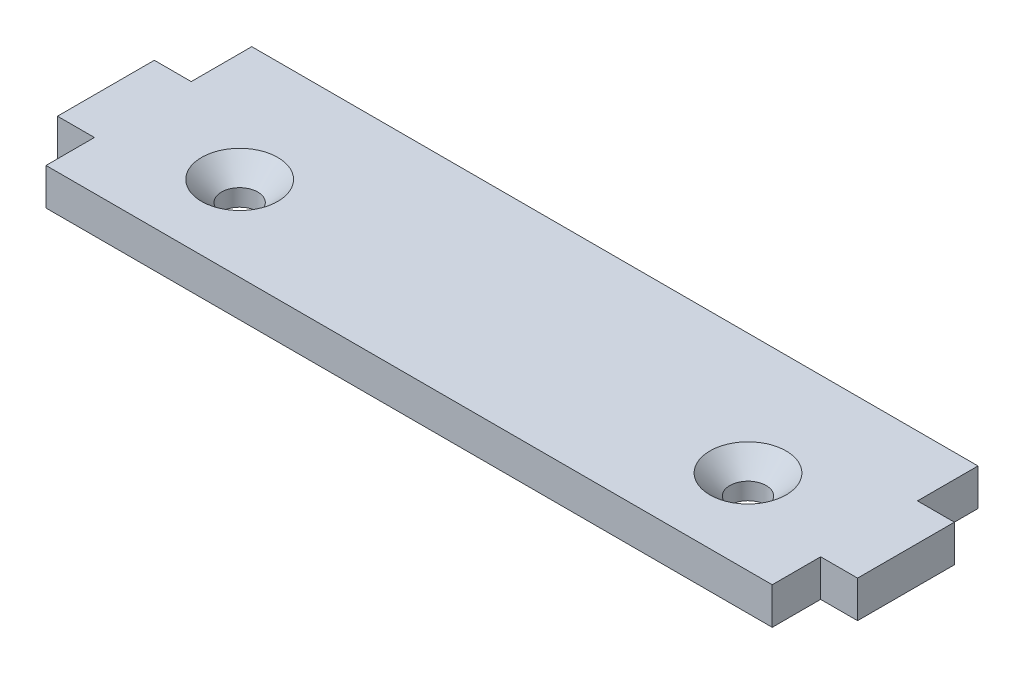
ISO-10303-21;
HEADER;
FILE_DESCRIPTION(('STEP AP214'),'2;1');
FILE_NAME('part.step','',(''),(''),'','','');
FILE_SCHEMA(('AUTOMOTIVE_DESIGN { 1 0 10303 214 1 1 1 1 }'));
ENDSEC;
DATA;
#1=APPLICATION_CONTEXT('core data for automotive mechanical design processes');
#2=APPLICATION_PROTOCOL_DEFINITION('international standard','automotive_design',2000,#1);
#3=PRODUCT_CONTEXT('',#1,'mechanical');
#4=PRODUCT('Part','Part','',(#3));
#5=PRODUCT_RELATED_PRODUCT_CATEGORY('part','',(#4));
#6=PRODUCT_DEFINITION_FORMATION('','',#4);
#7=PRODUCT_DEFINITION_CONTEXT('part definition',#1,'design');
#8=PRODUCT_DEFINITION('design','',#6,#7);
#9=PRODUCT_DEFINITION_SHAPE('','',#8);
#10=(LENGTH_UNIT() NAMED_UNIT(*) SI_UNIT(.MILLI.,.METRE.));
#11=(NAMED_UNIT(*) PLANE_ANGLE_UNIT() SI_UNIT($,.RADIAN.));
#12=(NAMED_UNIT(*) SI_UNIT($,.STERADIAN.) SOLID_ANGLE_UNIT());
#13=UNCERTAINTY_MEASURE_WITH_UNIT(LENGTH_MEASURE(1.E-05),#10,'distance_accuracy_value','');
#14=(GEOMETRIC_REPRESENTATION_CONTEXT(3) GLOBAL_UNCERTAINTY_ASSIGNED_CONTEXT((#13)) GLOBAL_UNIT_ASSIGNED_CONTEXT((#10,
#11,#12)) REPRESENTATION_CONTEXT('',''));
#15=CARTESIAN_POINT('',(0.,0.,0.));
#16=DIRECTION('',(0.,0.,1.));
#17=DIRECTION('',(1.,0.,0.));
#18=AXIS2_PLACEMENT_3D('',#15,#16,#17);
#19=CARTESIAN_POINT('',(66.1,3.05,0.));
#20=DIRECTION('',(-1.,0.,0.));
#21=DIRECTION('',(0.,0.,1.));
#22=AXIS2_PLACEMENT_3D('',#19,#20,#21);
#23=PLANE('',#22);
#24=DIRECTION('',(0.,0.,-1.));
#25=VECTOR('',#24,1.);
#26=CARTESIAN_POINT('',(66.1,0.,0.));
#27=LINE('',#26,#25);
#28=CARTESIAN_POINT('',(66.1,0.,-4.));
#29=VERTEX_POINT('',#28);
#30=CARTESIAN_POINT('',(66.1,0.,-12.));
#31=VERTEX_POINT('',#30);
#32=EDGE_CURVE('E180',#29,#31,#27,.T.);
#33=ORIENTED_EDGE('',*,*,#32,.T.);
#34=DIRECTION('',(0.,-1.,0.));
#35=VECTOR('',#34,1.);
#36=CARTESIAN_POINT('',(66.1,3.05,-12.));
#37=LINE('',#36,#35);
#38=CARTESIAN_POINT('',(66.1,3.05,-12.));
#39=VERTEX_POINT('',#38);
#40=EDGE_CURVE('E11',#39,#31,#37,.T.);
#41=ORIENTED_EDGE('',*,*,#40,.F.);
#42=DIRECTION('',(0.,0.,-1.));
#43=VECTOR('',#42,1.);
#44=CARTESIAN_POINT('',(66.1,3.05,0.));
#45=LINE('',#44,#43);
#46=CARTESIAN_POINT('',(66.1,3.05,-4.));
#47=VERTEX_POINT('',#46);
#48=EDGE_CURVE('E224',#47,#39,#45,.T.);
#49=ORIENTED_EDGE('',*,*,#48,.F.);
#50=DIRECTION('',(0.,-1.,0.));
#51=VECTOR('',#50,1.);
#52=CARTESIAN_POINT('',(66.1,3.05,-4.));
#53=LINE('',#52,#51);
#54=EDGE_CURVE('E63',#47,#29,#53,.T.);
#55=ORIENTED_EDGE('',*,*,#54,.T.);
#56=EDGE_LOOP('',(#33,#41,#49,#55));
#57=FACE_BOUND('',#56,.T.);
#58=ADVANCED_FACE('F45',(#57),#23,.F.);
#59=CARTESIAN_POINT('',(0.,3.05,-12.));
#60=DIRECTION('',(0.,0.,1.));
#61=DIRECTION('',(1.,0.,0.));
#62=AXIS2_PLACEMENT_3D('',#59,#60,#61);
#63=PLANE('',#62);
#64=DIRECTION('',(-1.,0.,0.));
#65=VECTOR('',#64,1.);
#66=CARTESIAN_POINT('',(0.,0.,-12.));
#67=LINE('',#66,#65);
#68=CARTESIAN_POINT('',(63.05,0.,-12.));
#69=VERTEX_POINT('',#68);
#70=EDGE_CURVE('E183',#31,#69,#67,.T.);
#71=ORIENTED_EDGE('',*,*,#70,.T.);
#72=DIRECTION('',(0.,-1.,0.));
#73=VECTOR('',#72,1.);
#74=CARTESIAN_POINT('',(63.05,3.05,-12.));
#75=LINE('',#74,#73);
#76=CARTESIAN_POINT('',(63.05,3.05,-12.));
#77=VERTEX_POINT('',#76);
#78=EDGE_CURVE('E55',#77,#69,#75,.T.);
#79=ORIENTED_EDGE('',*,*,#78,.F.);
#80=DIRECTION('',(-1.,0.,0.));
#81=VECTOR('',#80,1.);
#82=CARTESIAN_POINT('',(0.,3.05,-12.));
#83=LINE('',#82,#81);
#84=EDGE_CURVE('E114',#39,#77,#83,.T.);
#85=ORIENTED_EDGE('',*,*,#84,.F.);
#86=ORIENTED_EDGE('',*,*,#40,.T.);
#87=EDGE_LOOP('',(#71,#79,#85,#86));
#88=FACE_BOUND('',#87,.T.);
#89=ADVANCED_FACE('F255',(#88),#63,.F.);
#90=CARTESIAN_POINT('',(63.0499999999999,3.05,3.4999780851308E-13));
#91=DIRECTION('',(1.,0.,0.));
#92=DIRECTION('',(0.,0.,-1.));
#93=AXIS2_PLACEMENT_3D('',#90,#91,#92);
#94=PLANE('',#93);
#95=DIRECTION('',(0.,0.,1.));
#96=VECTOR('',#95,1.);
#97=CARTESIAN_POINT('',(63.0499999999999,0.,3.4999780851308E-13));
#98=LINE('',#97,#96);
#99=CARTESIAN_POINT('',(63.05,0.,-17.));
#100=VERTEX_POINT('',#99);
#101=EDGE_CURVE('E187',#100,#69,#98,.T.);
#102=ORIENTED_EDGE('',*,*,#101,.F.);
#103=DIRECTION('',(0.,-1.,0.));
#104=VECTOR('',#103,1.);
#105=CARTESIAN_POINT('',(63.05,3.05,-17.));
#106=LINE('',#105,#104);
#107=CARTESIAN_POINT('',(63.05,3.05,-17.));
#108=VERTEX_POINT('',#107);
#109=EDGE_CURVE('E246',#108,#100,#106,.T.);
#110=ORIENTED_EDGE('',*,*,#109,.F.);
#111=DIRECTION('',(0.,0.,1.));
#112=VECTOR('',#111,1.);
#113=CARTESIAN_POINT('',(63.0499999999999,3.05,3.4999780851308E-13));
#114=LINE('',#113,#112);
#115=EDGE_CURVE('E254',#108,#77,#114,.T.);
#116=ORIENTED_EDGE('',*,*,#115,.T.);
#117=ORIENTED_EDGE('',*,*,#78,.T.);
#118=EDGE_LOOP('',(#102,#110,#116,#117));
#119=FACE_BOUND('',#118,.T.);
#120=ADVANCED_FACE('F252',(#119),#94,.T.);
#121=CARTESIAN_POINT('',(0.,3.05,-17.));
#122=DIRECTION('',(0.,0.,-1.));
#123=DIRECTION('',(-1.,0.,0.));
#124=AXIS2_PLACEMENT_3D('',#121,#122,#123);
#125=PLANE('',#124);
#126=DIRECTION('',(1.,0.,0.));
#127=VECTOR('',#126,1.);
#128=CARTESIAN_POINT('',(0.,0.,-17.));
#129=LINE('',#128,#127);
#130=CARTESIAN_POINT('',(3.05,0.,-17.));
#131=VERTEX_POINT('',#130);
#132=EDGE_CURVE('E191',#131,#100,#129,.T.);
#133=ORIENTED_EDGE('',*,*,#132,.F.);
#134=DIRECTION('',(0.,-1.,0.));
#135=VECTOR('',#134,1.);
#136=CARTESIAN_POINT('',(3.05,3.05,-17.));
#137=LINE('',#136,#135);
#138=CARTESIAN_POINT('',(3.05,3.05,-17.));
#139=VERTEX_POINT('',#138);
#140=EDGE_CURVE('E243',#139,#131,#137,.T.);
#141=ORIENTED_EDGE('',*,*,#140,.F.);
#142=DIRECTION('',(1.,0.,0.));
#143=VECTOR('',#142,1.);
#144=CARTESIAN_POINT('',(0.,3.05,-17.));
#145=LINE('',#144,#143);
#146=EDGE_CURVE('E266',#139,#108,#145,.T.);
#147=ORIENTED_EDGE('',*,*,#146,.T.);
#148=ORIENTED_EDGE('',*,*,#109,.T.);
#149=EDGE_LOOP('',(#133,#141,#147,#148));
#150=FACE_BOUND('',#149,.T.);
#151=ADVANCED_FACE('F262',(#150),#125,.T.);
#152=CARTESIAN_POINT('',(3.05,3.05,0.));
#153=DIRECTION('',(1.,0.,0.));
#154=DIRECTION('',(0.,0.,-1.));
#155=AXIS2_PLACEMENT_3D('',#152,#153,#154);
#156=PLANE('',#155);
#157=DIRECTION('',(0.,0.,1.));
#158=VECTOR('',#157,1.);
#159=CARTESIAN_POINT('',(3.05,0.,0.));
#160=LINE('',#159,#158);
#161=CARTESIAN_POINT('',(3.05,0.,-12.));
#162=VERTEX_POINT('',#161);
#163=EDGE_CURVE('E195',#131,#162,#160,.T.);
#164=ORIENTED_EDGE('',*,*,#163,.T.);
#165=DIRECTION('',(0.,-1.,0.));
#166=VECTOR('',#165,1.);
#167=CARTESIAN_POINT('',(3.05,3.05,-12.));
#168=LINE('',#167,#166);
#169=CARTESIAN_POINT('',(3.05,3.05,-12.));
#170=VERTEX_POINT('',#169);
#171=EDGE_CURVE('E240',#170,#162,#168,.T.);
#172=ORIENTED_EDGE('',*,*,#171,.F.);
#173=DIRECTION('',(0.,0.,1.));
#174=VECTOR('',#173,1.);
#175=CARTESIAN_POINT('',(3.05,3.05,0.));
#176=LINE('',#175,#174);
#177=EDGE_CURVE('E271',#139,#170,#176,.T.);
#178=ORIENTED_EDGE('',*,*,#177,.F.);
#179=ORIENTED_EDGE('',*,*,#140,.T.);
#180=EDGE_LOOP('',(#164,#172,#178,#179));
#181=FACE_BOUND('',#180,.T.);
#182=ADVANCED_FACE('F468',(#181),#156,.F.);
#183=CARTESIAN_POINT('',(0.,3.05,-12.));
#184=DIRECTION('',(0.,0.,-1.));
#185=DIRECTION('',(-1.,0.,0.));
#186=AXIS2_PLACEMENT_3D('',#183,#184,#185);
#187=PLANE('',#186);
#188=DIRECTION('',(1.,0.,0.));
#189=VECTOR('',#188,1.);
#190=CARTESIAN_POINT('',(0.,0.,-12.));
#191=LINE('',#190,#189);
#192=CARTESIAN_POINT('',(0.,0.,-12.));
#193=VERTEX_POINT('',#192);
#194=EDGE_CURVE('E199',#193,#162,#191,.T.);
#195=ORIENTED_EDGE('',*,*,#194,.F.);
#196=DIRECTION('',(0.,-1.,0.));
#197=VECTOR('',#196,1.);
#198=CARTESIAN_POINT('',(0.,3.05,-12.));
#199=LINE('',#198,#197);
#200=CARTESIAN_POINT('',(0.,3.05,-12.));
#201=VERTEX_POINT('',#200);
#202=EDGE_CURVE('E237',#201,#193,#199,.T.);
#203=ORIENTED_EDGE('',*,*,#202,.F.);
#204=DIRECTION('',(1.,0.,0.));
#205=VECTOR('',#204,1.);
#206=CARTESIAN_POINT('',(0.,3.05,-12.));
#207=LINE('',#206,#205);
#208=EDGE_CURVE('E278',#201,#170,#207,.T.);
#209=ORIENTED_EDGE('',*,*,#208,.T.);
#210=ORIENTED_EDGE('',*,*,#171,.T.);
#211=EDGE_LOOP('',(#195,#203,#209,#210));
#212=FACE_BOUND('',#211,.T.);
#213=ADVANCED_FACE('F457',(#212),#187,.T.);
#214=CARTESIAN_POINT('',(0.,3.05,0.));
#215=DIRECTION('',(-1.,0.,0.));
#216=DIRECTION('',(0.,0.,1.));
#217=AXIS2_PLACEMENT_3D('',#214,#215,#216);
#218=PLANE('',#217);
#219=DIRECTION('',(0.,0.,-1.));
#220=VECTOR('',#219,1.);
#221=CARTESIAN_POINT('',(0.,0.,0.));
#222=LINE('',#221,#220);
#223=CARTESIAN_POINT('',(0.,0.,-4.));
#224=VERTEX_POINT('',#223);
#225=EDGE_CURVE('E203',#224,#193,#222,.T.);
#226=ORIENTED_EDGE('',*,*,#225,.F.);
#227=DIRECTION('',(0.,-1.,0.));
#228=VECTOR('',#227,1.);
#229=CARTESIAN_POINT('',(0.,3.05,-4.));
#230=LINE('',#229,#228);
#231=CARTESIAN_POINT('',(0.,3.05,-4.));
#232=VERTEX_POINT('',#231);
#233=EDGE_CURVE('E234',#232,#224,#230,.T.);
#234=ORIENTED_EDGE('',*,*,#233,.F.);
#235=DIRECTION('',(0.,0.,-1.));
#236=VECTOR('',#235,1.);
#237=CARTESIAN_POINT('',(0.,3.05,0.));
#238=LINE('',#237,#236);
#239=EDGE_CURVE('E282',#232,#201,#238,.T.);
#240=ORIENTED_EDGE('',*,*,#239,.T.);
#241=ORIENTED_EDGE('',*,*,#202,.T.);
#242=EDGE_LOOP('',(#226,#234,#240,#241));
#243=FACE_BOUND('',#242,.T.);
#244=ADVANCED_FACE('F446',(#243),#218,.T.);
#245=CARTESIAN_POINT('',(0.,3.05,-4.));
#246=DIRECTION('',(0.,0.,-1.));
#247=DIRECTION('',(-1.,0.,0.));
#248=AXIS2_PLACEMENT_3D('',#245,#246,#247);
#249=PLANE('',#248);
#250=DIRECTION('',(1.,0.,0.));
#251=VECTOR('',#250,1.);
#252=CARTESIAN_POINT('',(0.,0.,-4.));
#253=LINE('',#252,#251);
#254=CARTESIAN_POINT('',(3.05,0.,-4.));
#255=VERTEX_POINT('',#254);
#256=EDGE_CURVE('E207',#224,#255,#253,.T.);
#257=ORIENTED_EDGE('',*,*,#256,.T.);
#258=DIRECTION('',(0.,-1.,0.));
#259=VECTOR('',#258,1.);
#260=CARTESIAN_POINT('',(3.05,3.05,-4.));
#261=LINE('',#260,#259);
#262=CARTESIAN_POINT('',(3.05,3.05,-4.));
#263=VERTEX_POINT('',#262);
#264=EDGE_CURVE('E231',#263,#255,#261,.T.);
#265=ORIENTED_EDGE('',*,*,#264,.F.);
#266=DIRECTION('',(1.,0.,0.));
#267=VECTOR('',#266,1.);
#268=CARTESIAN_POINT('',(0.,3.05,-4.));
#269=LINE('',#268,#267);
#270=EDGE_CURVE('E286',#232,#263,#269,.T.);
#271=ORIENTED_EDGE('',*,*,#270,.F.);
#272=ORIENTED_EDGE('',*,*,#233,.T.);
#273=EDGE_LOOP('',(#257,#265,#271,#272));
#274=FACE_BOUND('',#273,.T.);
#275=ADVANCED_FACE('F435',(#274),#249,.F.);
#276=CARTESIAN_POINT('',(3.05,3.05,0.));
#277=DIRECTION('',(-1.,0.,0.));
#278=DIRECTION('',(0.,0.,1.));
#279=AXIS2_PLACEMENT_3D('',#276,#277,#278);
#280=PLANE('',#279);
#281=DIRECTION('',(0.,0.,-1.));
#282=VECTOR('',#281,1.);
#283=CARTESIAN_POINT('',(3.05,0.,0.));
#284=LINE('',#283,#282);
#285=CARTESIAN_POINT('',(3.05,0.,0.));
#286=VERTEX_POINT('',#285);
#287=EDGE_CURVE('E211',#286,#255,#284,.T.);
#288=ORIENTED_EDGE('',*,*,#287,.F.);
#289=DIRECTION('',(0.,-1.,0.));
#290=VECTOR('',#289,1.);
#291=CARTESIAN_POINT('',(3.05,3.05,0.));
#292=LINE('',#291,#290);
#293=CARTESIAN_POINT('',(3.05,3.05,0.));
#294=VERTEX_POINT('',#293);
#295=EDGE_CURVE('E161',#294,#286,#292,.T.);
#296=ORIENTED_EDGE('',*,*,#295,.F.);
#297=DIRECTION('',(0.,0.,-1.));
#298=VECTOR('',#297,1.);
#299=CARTESIAN_POINT('',(3.05,3.05,0.));
#300=LINE('',#299,#298);
#301=EDGE_CURVE('E149',#294,#263,#300,.T.);
#302=ORIENTED_EDGE('',*,*,#301,.T.);
#303=ORIENTED_EDGE('',*,*,#264,.T.);
#304=EDGE_LOOP('',(#288,#296,#302,#303));
#305=FACE_BOUND('',#304,.T.);
#306=ADVANCED_FACE('F291',(#305),#280,.T.);
#307=CARTESIAN_POINT('',(0.,3.05,0.));
#308=DIRECTION('',(0.,0.,-1.));
#309=DIRECTION('',(-1.,0.,0.));
#310=AXIS2_PLACEMENT_3D('',#307,#308,#309);
#311=PLANE('',#310);
#312=DIRECTION('',(1.,0.,0.));
#313=VECTOR('',#312,1.);
#314=CARTESIAN_POINT('',(0.,0.,0.));
#315=LINE('',#314,#313);
#316=CARTESIAN_POINT('',(63.05,0.,0.));
#317=VERTEX_POINT('',#316);
#318=EDGE_CURVE('E157',#286,#317,#315,.T.);
#319=ORIENTED_EDGE('',*,*,#318,.T.);
#320=DIRECTION('',(0.,-1.,0.));
#321=VECTOR('',#320,1.);
#322=CARTESIAN_POINT('',(63.05,3.05,0.));
#323=LINE('',#322,#321);
#324=CARTESIAN_POINT('',(63.05,3.05,0.));
#325=VERTEX_POINT('',#324);
#326=EDGE_CURVE('E154',#325,#317,#323,.T.);
#327=ORIENTED_EDGE('',*,*,#326,.F.);
#328=DIRECTION('',(1.,0.,0.));
#329=VECTOR('',#328,1.);
#330=CARTESIAN_POINT('',(0.,3.05,0.));
#331=LINE('',#330,#329);
#332=EDGE_CURVE('E142',#294,#325,#331,.T.);
#333=ORIENTED_EDGE('',*,*,#332,.F.);
#334=ORIENTED_EDGE('',*,*,#295,.T.);
#335=EDGE_LOOP('',(#319,#327,#333,#334));
#336=FACE_BOUND('',#335,.T.);
#337=ADVANCED_FACE('F155',(#336),#311,.F.);
#338=CARTESIAN_POINT('',(63.05,3.05,0.));
#339=DIRECTION('',(-1.,0.,0.));
#340=DIRECTION('',(0.,0.,1.));
#341=AXIS2_PLACEMENT_3D('',#338,#339,#340);
#342=PLANE('',#341);
#343=DIRECTION('',(0.,0.,-1.));
#344=VECTOR('',#343,1.);
#345=CARTESIAN_POINT('',(63.05,0.,0.));
#346=LINE('',#345,#344);
#347=CARTESIAN_POINT('',(63.05,0.,-4.));
#348=VERTEX_POINT('',#347);
#349=EDGE_CURVE('E217',#317,#348,#346,.T.);
#350=ORIENTED_EDGE('',*,*,#349,.T.);
#351=DIRECTION('',(0.,-1.,0.));
#352=VECTOR('',#351,1.);
#353=CARTESIAN_POINT('',(63.05,3.05,-4.));
#354=LINE('',#353,#352);
#355=CARTESIAN_POINT('',(63.05,3.05,-4.));
#356=VERTEX_POINT('',#355);
#357=EDGE_CURVE('E102',#356,#348,#354,.T.);
#358=ORIENTED_EDGE('',*,*,#357,.F.);
#359=DIRECTION('',(0.,0.,-1.));
#360=VECTOR('',#359,1.);
#361=CARTESIAN_POINT('',(63.05,3.05,0.));
#362=LINE('',#361,#360);
#363=EDGE_CURVE('E147',#325,#356,#362,.T.);
#364=ORIENTED_EDGE('',*,*,#363,.F.);
#365=ORIENTED_EDGE('',*,*,#326,.T.);
#366=EDGE_LOOP('',(#350,#358,#364,#365));
#367=FACE_BOUND('',#366,.T.);
#368=ADVANCED_FACE('F163',(#367),#342,.F.);
#369=CARTESIAN_POINT('',(12.05,3.05,-7.));
#370=DIRECTION('',(0.,-1.,0.));
#371=DIRECTION('',(0.,0.,-1.));
#372=AXIS2_PLACEMENT_3D('',#369,#370,#371);
#373=CYLINDRICAL_SURFACE('',#372,1.5);
#374=CARTESIAN_POINT('',(12.05,1.4,-7.));
#375=DIRECTION('',(0.,1.,0.));
#376=DIRECTION('',(0.,0.,1.));
#377=AXIS2_PLACEMENT_3D('',#374,#375,#376);
#378=CIRCLE('',#377,1.5);
#379=CARTESIAN_POINT('',(12.05,1.4,-5.5));
#380=VERTEX_POINT('',#379);
#381=EDGE_CURVE('E176',#380,#380,#378,.T.);
#382=ORIENTED_EDGE('',*,*,#381,.T.);
#383=EDGE_LOOP('',(#382));
#384=FACE_BOUND('',#383,.T.);
#385=CARTESIAN_POINT('',(12.05,0.,-7.));
#386=DIRECTION('',(0.,1.,0.));
#387=DIRECTION('',(0.,0.,1.));
#388=AXIS2_PLACEMENT_3D('',#385,#386,#387);
#389=CIRCLE('',#388,1.5);
#390=CARTESIAN_POINT('',(12.05,0.,-5.5));
#391=VERTEX_POINT('',#390);
#392=EDGE_CURVE('E175',#391,#391,#389,.T.);
#393=ORIENTED_EDGE('',*,*,#392,.F.);
#394=EDGE_LOOP('',(#393));
#395=FACE_BOUND('',#394,.T.);
#396=ADVANCED_FACE('F303',(#384,#395),#373,.F.);
#397=CARTESIAN_POINT('',(54.05,3.05,-7.));
#398=DIRECTION('',(0.,-1.,0.));
#399=DIRECTION('',(0.,0.,-1.));
#400=AXIS2_PLACEMENT_3D('',#397,#398,#399);
#401=CYLINDRICAL_SURFACE('',#400,1.5);
#402=CARTESIAN_POINT('',(54.05,1.4,-7.));
#403=DIRECTION('',(0.,1.,0.));
#404=DIRECTION('',(0.,0.,1.));
#405=AXIS2_PLACEMENT_3D('',#402,#403,#404);
#406=CIRCLE('',#405,1.5);
#407=CARTESIAN_POINT('',(54.05,1.4,-5.5));
#408=VERTEX_POINT('',#407);
#409=EDGE_CURVE('E341',#408,#408,#406,.T.);
#410=ORIENTED_EDGE('',*,*,#409,.T.);
#411=EDGE_LOOP('',(#410));
#412=FACE_BOUND('',#411,.T.);
#413=CARTESIAN_POINT('',(54.05,0.,-7.));
#414=DIRECTION('',(0.,1.,0.));
#415=DIRECTION('',(0.,0.,1.));
#416=AXIS2_PLACEMENT_3D('',#413,#414,#415);
#417=CIRCLE('',#416,1.5);
#418=CARTESIAN_POINT('',(54.05,0.,-5.5));
#419=VERTEX_POINT('',#418);
#420=EDGE_CURVE('E171',#419,#419,#417,.T.);
#421=ORIENTED_EDGE('',*,*,#420,.F.);
#422=EDGE_LOOP('',(#421));
#423=FACE_BOUND('',#422,.T.);
#424=ADVANCED_FACE('F47',(#412,#423),#401,.F.);
#425=CARTESIAN_POINT('',(0.,3.05,-4.));
#426=DIRECTION('',(0.,0.,1.));
#427=DIRECTION('',(1.,0.,0.));
#428=AXIS2_PLACEMENT_3D('',#425,#426,#427);
#429=PLANE('',#428);
#430=DIRECTION('',(-1.,0.,0.));
#431=VECTOR('',#430,1.);
#432=CARTESIAN_POINT('',(0.,0.,-4.));
#433=LINE('',#432,#431);
#434=EDGE_CURVE('E220',#29,#348,#433,.T.);
#435=ORIENTED_EDGE('',*,*,#434,.F.);
#436=ORIENTED_EDGE('',*,*,#54,.F.);
#437=DIRECTION('',(-1.,0.,0.));
#438=VECTOR('',#437,1.);
#439=CARTESIAN_POINT('',(0.,3.05,-4.));
#440=LINE('',#439,#438);
#441=EDGE_CURVE('E165',#47,#356,#440,.T.);
#442=ORIENTED_EDGE('',*,*,#441,.T.);
#443=ORIENTED_EDGE('',*,*,#357,.T.);
#444=EDGE_LOOP('',(#435,#436,#442,#443));
#445=FACE_BOUND('',#444,.T.);
#446=ADVANCED_FACE('F294',(#445),#429,.T.);
#447=CARTESIAN_POINT('',(0.,3.05,0.));
#448=DIRECTION('',(0.,1.,0.));
#449=DIRECTION('',(0.,0.,1.));
#450=AXIS2_PLACEMENT_3D('',#447,#448,#449);
#451=PLANE('',#450);
#452=CARTESIAN_POINT('',(54.05,3.05,-7.));
#453=DIRECTION('',(0.,1.,0.));
#454=DIRECTION('',(0.,0.,1.));
#455=AXIS2_PLACEMENT_3D('',#452,#453,#454);
#456=CIRCLE('',#455,3.15);
#457=CARTESIAN_POINT('',(54.05,3.05,-3.85));
#458=VERTEX_POINT('',#457);
#459=EDGE_CURVE('E344',#458,#458,#456,.T.);
#460=ORIENTED_EDGE('',*,*,#459,.F.);
#461=EDGE_LOOP('',(#460));
#462=FACE_BOUND('',#461,.T.);
#463=CARTESIAN_POINT('',(12.05,3.05,-7.));
#464=DIRECTION('',(0.,1.,0.));
#465=DIRECTION('',(0.,0.,1.));
#466=AXIS2_PLACEMENT_3D('',#463,#464,#465);
#467=CIRCLE('',#466,3.15);
#468=CARTESIAN_POINT('',(12.05,3.05,-3.85));
#469=VERTEX_POINT('',#468);
#470=EDGE_CURVE('E348',#469,#469,#467,.T.);
#471=ORIENTED_EDGE('',*,*,#470,.F.);
#472=EDGE_LOOP('',(#471));
#473=FACE_BOUND('',#472,.T.);
#474=ORIENTED_EDGE('',*,*,#48,.T.);
#475=ORIENTED_EDGE('',*,*,#84,.T.);
#476=ORIENTED_EDGE('',*,*,#115,.F.);
#477=ORIENTED_EDGE('',*,*,#146,.F.);
#478=ORIENTED_EDGE('',*,*,#177,.T.);
#479=ORIENTED_EDGE('',*,*,#208,.F.);
#480=ORIENTED_EDGE('',*,*,#239,.F.);
#481=ORIENTED_EDGE('',*,*,#270,.T.);
#482=ORIENTED_EDGE('',*,*,#301,.F.);
#483=ORIENTED_EDGE('',*,*,#332,.T.);
#484=ORIENTED_EDGE('',*,*,#363,.T.);
#485=ORIENTED_EDGE('',*,*,#441,.F.);
#486=EDGE_LOOP('',(#474,#475,#476,#477,#478,#479,#480,#481,#482,#483,#484,#485));
#487=FACE_BOUND('',#486,.T.);
#488=ADVANCED_FACE('F144',(#462,#473,#487),#451,.T.);
#489=CARTESIAN_POINT('',(0.,0.,0.));
#490=DIRECTION('',(0.,1.,0.));
#491=DIRECTION('',(0.,0.,1.));
#492=AXIS2_PLACEMENT_3D('',#489,#490,#491);
#493=PLANE('',#492);
#494=ORIENTED_EDGE('',*,*,#420,.T.);
#495=EDGE_LOOP('',(#494));
#496=FACE_BOUND('',#495,.T.);
#497=ORIENTED_EDGE('',*,*,#392,.T.);
#498=EDGE_LOOP('',(#497));
#499=FACE_BOUND('',#498,.T.);
#500=ORIENTED_EDGE('',*,*,#32,.F.);
#501=ORIENTED_EDGE('',*,*,#434,.T.);
#502=ORIENTED_EDGE('',*,*,#349,.F.);
#503=ORIENTED_EDGE('',*,*,#318,.F.);
#504=ORIENTED_EDGE('',*,*,#287,.T.);
#505=ORIENTED_EDGE('',*,*,#256,.F.);
#506=ORIENTED_EDGE('',*,*,#225,.T.);
#507=ORIENTED_EDGE('',*,*,#194,.T.);
#508=ORIENTED_EDGE('',*,*,#163,.F.);
#509=ORIENTED_EDGE('',*,*,#132,.T.);
#510=ORIENTED_EDGE('',*,*,#101,.T.);
#511=ORIENTED_EDGE('',*,*,#70,.F.);
#512=EDGE_LOOP('',(#500,#501,#502,#503,#504,#505,#506,#507,#508,#509,#510,#511));
#513=FACE_BOUND('',#512,.T.);
#514=ADVANCED_FACE('F258',(#496,#499,#513),#493,.F.);
#515=CARTESIAN_POINT('',(12.05,3.05,-7.));
#516=DIRECTION('',(0.,1.,0.));
#517=DIRECTION('',(0.,0.,1.));
#518=AXIS2_PLACEMENT_3D('',#515,#516,#517);
#519=CONICAL_SURFACE('',#518,3.15,0.785398163397449);
#520=ORIENTED_EDGE('',*,*,#381,.F.);
#521=EDGE_LOOP('',(#520));
#522=FACE_BOUND('',#521,.T.);
#523=ORIENTED_EDGE('',*,*,#470,.T.);
#524=EDGE_LOOP('',(#523));
#525=FACE_BOUND('',#524,.T.);
#526=ADVANCED_FACE('F325',(#522,#525),#519,.F.);
#527=CARTESIAN_POINT('',(54.05,3.05,-7.));
#528=DIRECTION('',(0.,1.,0.));
#529=DIRECTION('',(0.,0.,1.));
#530=AXIS2_PLACEMENT_3D('',#527,#528,#529);
#531=CONICAL_SURFACE('',#530,3.15,0.785398163397448);
#532=ORIENTED_EDGE('',*,*,#409,.F.);
#533=EDGE_LOOP('',(#532));
#534=FACE_BOUND('',#533,.T.);
#535=ORIENTED_EDGE('',*,*,#459,.T.);
#536=EDGE_LOOP('',(#535));
#537=FACE_BOUND('',#536,.T.);
#538=ADVANCED_FACE('F330',(#534,#537),#531,.F.);
#539=CLOSED_SHELL('',(#58,#89,#120,#151,#182,#213,#244,#275,#306,#337,#368,#396,#424,#446,#488,
#514,#526,#538));
#540=MANIFOLD_SOLID_BREP('B2',#539);
#541=ADVANCED_BREP_SHAPE_REPRESENTATION('',(#18,#540),#14);
#542=SHAPE_DEFINITION_REPRESENTATION(#9,#541);
ENDSEC;
END-ISO-10303-21;
